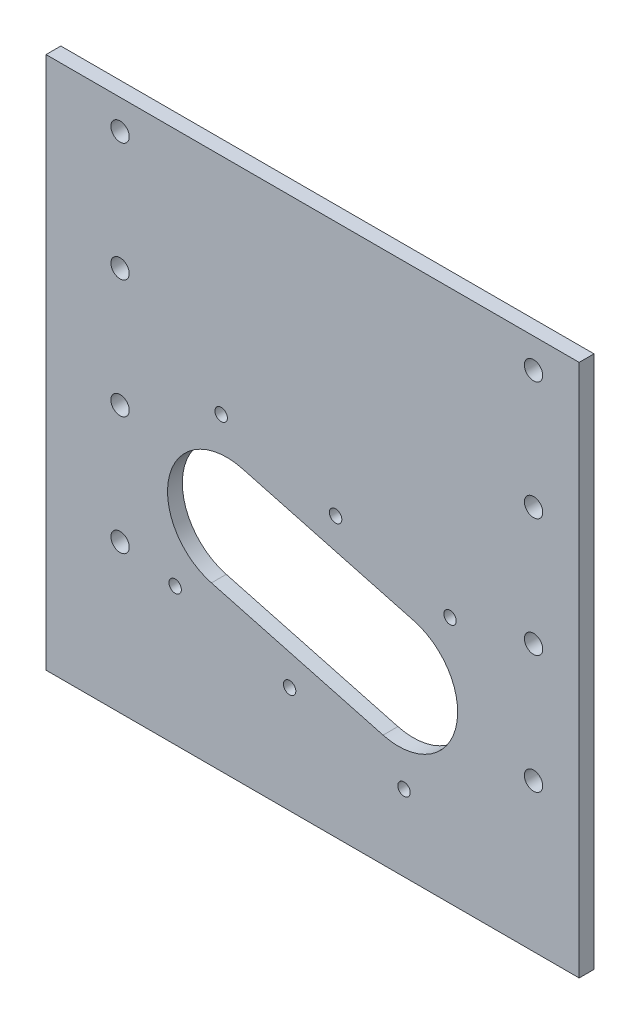
ISO-10303-21;
HEADER;
FILE_DESCRIPTION(('STEP AP214'),'2;1');
FILE_NAME('part.step','',(''),(''),'','','');
FILE_SCHEMA(('AUTOMOTIVE_DESIGN { 1 0 10303 214 1 1 1 1 }'));
ENDSEC;
DATA;
#1=APPLICATION_CONTEXT('core data for automotive mechanical design processes');
#2=APPLICATION_PROTOCOL_DEFINITION('international standard','automotive_design',2000,#1);
#3=PRODUCT_CONTEXT('',#1,'mechanical');
#4=PRODUCT('Part','Part','',(#3));
#5=PRODUCT_RELATED_PRODUCT_CATEGORY('part','',(#4));
#6=PRODUCT_DEFINITION_FORMATION('','',#4);
#7=PRODUCT_DEFINITION_CONTEXT('part definition',#1,'design');
#8=PRODUCT_DEFINITION('design','',#6,#7);
#9=PRODUCT_DEFINITION_SHAPE('','',#8);
#10=(LENGTH_UNIT() NAMED_UNIT(*) SI_UNIT(.MILLI.,.METRE.));
#11=(NAMED_UNIT(*) PLANE_ANGLE_UNIT() SI_UNIT($,.RADIAN.));
#12=(NAMED_UNIT(*) SI_UNIT($,.STERADIAN.) SOLID_ANGLE_UNIT());
#13=UNCERTAINTY_MEASURE_WITH_UNIT(LENGTH_MEASURE(1.E-05),#10,'distance_accuracy_value','');
#14=(GEOMETRIC_REPRESENTATION_CONTEXT(3) GLOBAL_UNCERTAINTY_ASSIGNED_CONTEXT((#13)) GLOBAL_UNIT_ASSIGNED_CONTEXT((#10,
#11,#12)) REPRESENTATION_CONTEXT('',''));
#15=CARTESIAN_POINT('',(0.,0.,0.));
#16=DIRECTION('',(0.,0.,1.));
#17=DIRECTION('',(1.,0.,0.));
#18=AXIS2_PLACEMENT_3D('',#15,#16,#17);
#19=CARTESIAN_POINT('',(90.,-90.,5.));
#20=DIRECTION('',(-1.,0.,0.));
#21=DIRECTION('',(0.,0.,1.));
#22=AXIS2_PLACEMENT_3D('',#19,#20,#21);
#23=PLANE('',#22);
#24=DIRECTION('',(0.,1.,0.));
#25=VECTOR('',#24,1.);
#26=CARTESIAN_POINT('',(90.,-90.,0.));
#27=LINE('',#26,#25);
#28=CARTESIAN_POINT('',(90.,-90.,0.));
#29=VERTEX_POINT('',#28);
#30=CARTESIAN_POINT('',(90.,90.,0.));
#31=VERTEX_POINT('',#30);
#32=EDGE_CURVE('E134',#29,#31,#27,.T.);
#33=ORIENTED_EDGE('',*,*,#32,.T.);
#34=DIRECTION('',(0.,0.,-1.));
#35=VECTOR('',#34,1.);
#36=CARTESIAN_POINT('',(90.,90.,5.));
#37=LINE('',#36,#35);
#38=CARTESIAN_POINT('',(90.,90.,5.));
#39=VERTEX_POINT('',#38);
#40=EDGE_CURVE('E11',#39,#31,#37,.T.);
#41=ORIENTED_EDGE('',*,*,#40,.F.);
#42=DIRECTION('',(0.,1.,0.));
#43=VECTOR('',#42,1.);
#44=CARTESIAN_POINT('',(90.,-90.,5.));
#45=LINE('',#44,#43);
#46=CARTESIAN_POINT('',(90.,-90.,5.));
#47=VERTEX_POINT('',#46);
#48=EDGE_CURVE('E138',#47,#39,#45,.T.);
#49=ORIENTED_EDGE('',*,*,#48,.F.);
#50=DIRECTION('',(0.,0.,-1.));
#51=VECTOR('',#50,1.);
#52=CARTESIAN_POINT('',(90.,-90.,5.));
#53=LINE('',#52,#51);
#54=EDGE_CURVE('E148',#47,#29,#53,.T.);
#55=ORIENTED_EDGE('',*,*,#54,.T.);
#56=EDGE_LOOP('',(#33,#41,#49,#55));
#57=FACE_BOUND('',#56,.T.);
#58=ADVANCED_FACE('F33',(#57),#23,.F.);
#59=CARTESIAN_POINT('',(-90.,90.,5.));
#60=DIRECTION('',(0.,-1.,0.));
#61=DIRECTION('',(0.,0.,-1.));
#62=AXIS2_PLACEMENT_3D('',#59,#60,#61);
#63=PLANE('',#62);
#64=DIRECTION('',(-1.,0.,0.));
#65=VECTOR('',#64,1.);
#66=CARTESIAN_POINT('',(-90.,90.,0.));
#67=LINE('',#66,#65);
#68=CARTESIAN_POINT('',(-90.,90.,0.));
#69=VERTEX_POINT('',#68);
#70=EDGE_CURVE('E151',#31,#69,#67,.T.);
#71=ORIENTED_EDGE('',*,*,#70,.T.);
#72=DIRECTION('',(0.,0.,-1.));
#73=VECTOR('',#72,1.);
#74=CARTESIAN_POINT('',(-90.,90.,5.));
#75=LINE('',#74,#73);
#76=CARTESIAN_POINT('',(-90.,90.,5.));
#77=VERTEX_POINT('',#76);
#78=EDGE_CURVE('E40',#77,#69,#75,.T.);
#79=ORIENTED_EDGE('',*,*,#78,.F.);
#80=DIRECTION('',(-1.,0.,0.));
#81=VECTOR('',#80,1.);
#82=CARTESIAN_POINT('',(-90.,90.,5.));
#83=LINE('',#82,#81);
#84=EDGE_CURVE('E141',#39,#77,#83,.T.);
#85=ORIENTED_EDGE('',*,*,#84,.F.);
#86=ORIENTED_EDGE('',*,*,#40,.T.);
#87=EDGE_LOOP('',(#71,#79,#85,#86));
#88=FACE_BOUND('',#87,.T.);
#89=ADVANCED_FACE('F179',(#88),#63,.F.);
#90=CARTESIAN_POINT('',(-90.,-90.,5.));
#91=DIRECTION('',(1.,0.,0.));
#92=DIRECTION('',(0.,0.,-1.));
#93=AXIS2_PLACEMENT_3D('',#90,#91,#92);
#94=PLANE('',#93);
#95=DIRECTION('',(0.,-1.,0.));
#96=VECTOR('',#95,1.);
#97=CARTESIAN_POINT('',(-90.,-90.,0.));
#98=LINE('',#97,#96);
#99=CARTESIAN_POINT('',(-90.,-90.,0.));
#100=VERTEX_POINT('',#99);
#101=EDGE_CURVE('E153',#69,#100,#98,.T.);
#102=ORIENTED_EDGE('',*,*,#101,.T.);
#103=DIRECTION('',(0.,0.,-1.));
#104=VECTOR('',#103,1.);
#105=CARTESIAN_POINT('',(-90.,-90.,5.));
#106=LINE('',#105,#104);
#107=CARTESIAN_POINT('',(-90.,-90.,5.));
#108=VERTEX_POINT('',#107);
#109=EDGE_CURVE('E158',#108,#100,#106,.T.);
#110=ORIENTED_EDGE('',*,*,#109,.F.);
#111=DIRECTION('',(0.,-1.,0.));
#112=VECTOR('',#111,1.);
#113=CARTESIAN_POINT('',(-90.,-90.,5.));
#114=LINE('',#113,#112);
#115=EDGE_CURVE('E144',#77,#108,#114,.T.);
#116=ORIENTED_EDGE('',*,*,#115,.F.);
#117=ORIENTED_EDGE('',*,*,#78,.T.);
#118=EDGE_LOOP('',(#102,#110,#116,#117));
#119=FACE_BOUND('',#118,.T.);
#120=ADVANCED_FACE('F165',(#119),#94,.F.);
#121=CARTESIAN_POINT('',(-90.,-90.,5.));
#122=DIRECTION('',(0.,1.,0.));
#123=DIRECTION('',(0.,0.,1.));
#124=AXIS2_PLACEMENT_3D('',#121,#122,#123);
#125=PLANE('',#124);
#126=DIRECTION('',(1.,0.,0.));
#127=VECTOR('',#126,1.);
#128=CARTESIAN_POINT('',(-90.,-90.,0.));
#129=LINE('',#128,#127);
#130=EDGE_CURVE('E142',#100,#29,#129,.T.);
#131=ORIENTED_EDGE('',*,*,#130,.T.);
#132=ORIENTED_EDGE('',*,*,#54,.F.);
#133=DIRECTION('',(1.,0.,0.));
#134=VECTOR('',#133,1.);
#135=CARTESIAN_POINT('',(-90.,-90.,5.));
#136=LINE('',#135,#134);
#137=EDGE_CURVE('E146',#108,#47,#136,.T.);
#138=ORIENTED_EDGE('',*,*,#137,.F.);
#139=ORIENTED_EDGE('',*,*,#109,.T.);
#140=EDGE_LOOP('',(#131,#132,#138,#139));
#141=FACE_BOUND('',#140,.T.);
#142=ADVANCED_FACE('F174',(#141),#125,.F.);
#143=CARTESIAN_POINT('',(0.,0.,5.));
#144=DIRECTION('',(0.,0.,-1.));
#145=DIRECTION('',(-1.,0.,0.));
#146=AXIS2_PLACEMENT_3D('',#143,#144,#145);
#147=PLANE('',#146);
#148=CARTESIAN_POINT('',(46.4016044046382,-6.37498701542849,5.));
#149=DIRECTION('',(0.,0.,-1.));
#150=DIRECTION('',(1.,0.,0.));
#151=AXIS2_PLACEMENT_3D('',#148,#149,#150);
#152=CIRCLE('',#151,2.1);
#153=CARTESIAN_POINT('',(48.5016044046383,-6.37498701542849,5.));
#154=VERTEX_POINT('',#153);
#155=EDGE_CURVE('E293',#154,#154,#152,.T.);
#156=ORIENTED_EDGE('',*,*,#155,.T.);
#157=EDGE_LOOP('',(#156));
#158=FACE_BOUND('',#157,.T.);
#159=CARTESIAN_POINT('',(-46.4016044046382,-43.6250129845715,5.));
#160=DIRECTION('',(0.,0.,-1.));
#161=DIRECTION('',(1.,0.,0.));
#162=AXIS2_PLACEMENT_3D('',#159,#160,#161);
#163=CIRCLE('',#162,2.10000000000002);
#164=CARTESIAN_POINT('',(-44.3016044046382,-43.6250129845715,5.));
#165=VERTEX_POINT('',#164);
#166=EDGE_CURVE('E287',#165,#165,#163,.T.);
#167=ORIENTED_EDGE('',*,*,#166,.T.);
#168=EDGE_LOOP('',(#167));
#169=FACE_BOUND('',#168,.T.);
#170=CARTESIAN_POINT('',(-30.8724616984873,14.3305365927727,5.));
#171=DIRECTION('',(0.,0.,-1.));
#172=DIRECTION('',(-1.,0.,0.));
#173=AXIS2_PLACEMENT_3D('',#170,#171,#172);
#174=CIRCLE('',#173,2.1);
#175=CARTESIAN_POINT('',(-32.9724616984873,14.3305365927727,5.));
#176=VERTEX_POINT('',#175);
#177=EDGE_CURVE('E281',#176,#176,#174,.T.);
#178=ORIENTED_EDGE('',*,*,#177,.T.);
#179=EDGE_LOOP('',(#178));
#180=FACE_BOUND('',#179,.T.);
#181=CARTESIAN_POINT('',(30.8724616984873,-64.3305365927728,5.));
#182=DIRECTION('',(0.,0.,-1.));
#183=DIRECTION('',(-1.,0.,0.));
#184=AXIS2_PLACEMENT_3D('',#181,#182,#183);
#185=CIRCLE('',#184,2.10000000000001);
#186=CARTESIAN_POINT('',(28.7724616984873,-64.3305365927728,5.));
#187=VERTEX_POINT('',#186);
#188=EDGE_CURVE('E271',#187,#187,#185,.T.);
#189=ORIENTED_EDGE('',*,*,#188,.T.);
#190=EDGE_LOOP('',(#189));
#191=FACE_BOUND('',#190,.T.);
#192=CARTESIAN_POINT('',(-7.76457135307544,-53.9777747886721,5.));
#193=DIRECTION('',(0.,0.,-1.));
#194=DIRECTION('',(1.,0.,0.));
#195=AXIS2_PLACEMENT_3D('',#192,#193,#194);
#196=CIRCLE('',#195,2.10000000000002);
#197=CARTESIAN_POINT('',(-5.66457135307543,-53.9777747886721,5.));
#198=VERTEX_POINT('',#197);
#199=EDGE_CURVE('E266',#198,#198,#196,.T.);
#200=ORIENTED_EDGE('',*,*,#199,.T.);
#201=EDGE_LOOP('',(#200));
#202=FACE_BOUND('',#201,.T.);
#203=CARTESIAN_POINT('',(7.76457135307546,3.97777478867212,5.));
#204=DIRECTION('',(0.,0.,-1.));
#205=DIRECTION('',(-1.,0.,0.));
#206=AXIS2_PLACEMENT_3D('',#203,#204,#205);
#207=CIRCLE('',#206,2.1);
#208=CARTESIAN_POINT('',(5.66457135307545,3.97777478867212,5.));
#209=VERTEX_POINT('',#208);
#210=EDGE_CURVE('E299',#209,#209,#207,.T.);
#211=ORIENTED_EDGE('',*,*,#210,.T.);
#212=EDGE_LOOP('',(#211));
#213=FACE_BOUND('',#212,.T.);
#214=CARTESIAN_POINT('',(74.6004090081324,80.0000000000011,5.));
#215=DIRECTION('',(0.,0.,-1.));
#216=DIRECTION('',(-1.,0.,0.));
#217=AXIS2_PLACEMENT_3D('',#214,#215,#216);
#218=CIRCLE('',#217,3.1);
#219=CARTESIAN_POINT('',(71.5004090081324,80.0000000000011,5.));
#220=VERTEX_POINT('',#219);
#221=EDGE_CURVE('E305',#220,#220,#218,.T.);
#222=ORIENTED_EDGE('',*,*,#221,.T.);
#223=EDGE_LOOP('',(#222));
#224=FACE_BOUND('',#223,.T.);
#225=CARTESIAN_POINT('',(74.6004090081324,40.0000000000011,5.));
#226=DIRECTION('',(0.,0.,-1.));
#227=DIRECTION('',(-1.,0.,0.));
#228=AXIS2_PLACEMENT_3D('',#225,#226,#227);
#229=CIRCLE('',#228,3.1);
#230=CARTESIAN_POINT('',(71.5004090081324,40.0000000000011,5.));
#231=VERTEX_POINT('',#230);
#232=EDGE_CURVE('E311',#231,#231,#229,.T.);
#233=ORIENTED_EDGE('',*,*,#232,.T.);
#234=EDGE_LOOP('',(#233));
#235=FACE_BOUND('',#234,.T.);
#236=CARTESIAN_POINT('',(74.6004090081324,1.09634523681734E-12,5.));
#237=DIRECTION('',(0.,0.,-1.));
#238=DIRECTION('',(-1.,0.,0.));
#239=AXIS2_PLACEMENT_3D('',#236,#237,#238);
#240=CIRCLE('',#239,3.1);
#241=CARTESIAN_POINT('',(71.5004090081324,1.09634523681734E-12,5.));
#242=VERTEX_POINT('',#241);
#243=EDGE_CURVE('E317',#242,#242,#240,.T.);
#244=ORIENTED_EDGE('',*,*,#243,.T.);
#245=EDGE_LOOP('',(#244));
#246=FACE_BOUND('',#245,.T.);
#247=CARTESIAN_POINT('',(74.6004090081324,-39.9999999999989,5.));
#248=DIRECTION('',(0.,0.,-1.));
#249=DIRECTION('',(-1.,0.,0.));
#250=AXIS2_PLACEMENT_3D('',#247,#248,#249);
#251=CIRCLE('',#250,3.1);
#252=CARTESIAN_POINT('',(71.5004090081324,-39.9999999999989,5.));
#253=VERTEX_POINT('',#252);
#254=EDGE_CURVE('E323',#253,#253,#251,.T.);
#255=ORIENTED_EDGE('',*,*,#254,.T.);
#256=EDGE_LOOP('',(#255));
#257=FACE_BOUND('',#256,.T.);
#258=CARTESIAN_POINT('',(-65.0000000000003,79.9999999999999,5.));
#259=DIRECTION('',(0.,0.,1.));
#260=DIRECTION('',(1.,0.,0.));
#261=AXIS2_PLACEMENT_3D('',#258,#259,#260);
#262=CIRCLE('',#261,3.1);
#263=CARTESIAN_POINT('',(-61.9000000000003,79.9999999999999,5.));
#264=VERTEX_POINT('',#263);
#265=EDGE_CURVE('E330',#264,#264,#262,.T.);
#266=ORIENTED_EDGE('',*,*,#265,.F.);
#267=EDGE_LOOP('',(#266));
#268=FACE_BOUND('',#267,.T.);
#269=CARTESIAN_POINT('',(-65.0000000000004,39.9999999999999,5.));
#270=DIRECTION('',(0.,0.,1.));
#271=DIRECTION('',(1.,0.,0.));
#272=AXIS2_PLACEMENT_3D('',#269,#270,#271);
#273=CIRCLE('',#272,3.1);
#274=CARTESIAN_POINT('',(-61.9000000000004,39.9999999999999,5.));
#275=VERTEX_POINT('',#274);
#276=EDGE_CURVE('E336',#275,#275,#273,.T.);
#277=ORIENTED_EDGE('',*,*,#276,.F.);
#278=EDGE_LOOP('',(#277));
#279=FACE_BOUND('',#278,.T.);
#280=CARTESIAN_POINT('',(-65.0000000000006,0.,5.));
#281=DIRECTION('',(0.,0.,1.));
#282=DIRECTION('',(1.,0.,0.));
#283=AXIS2_PLACEMENT_3D('',#280,#281,#282);
#284=CIRCLE('',#283,3.1);
#285=CARTESIAN_POINT('',(-61.9000000000006,0.,5.));
#286=VERTEX_POINT('',#285);
#287=EDGE_CURVE('E342',#286,#286,#284,.T.);
#288=ORIENTED_EDGE('',*,*,#287,.F.);
#289=EDGE_LOOP('',(#288));
#290=FACE_BOUND('',#289,.T.);
#291=CARTESIAN_POINT('',(-65.0000000000008,-40.0000000000001,5.));
#292=DIRECTION('',(0.,0.,1.));
#293=DIRECTION('',(1.,0.,0.));
#294=AXIS2_PLACEMENT_3D('',#291,#292,#293);
#295=CIRCLE('',#294,3.1);
#296=CARTESIAN_POINT('',(-61.9000000000008,-40.0000000000001,5.));
#297=VERTEX_POINT('',#296);
#298=EDGE_CURVE('E121',#297,#297,#295,.T.);
#299=ORIENTED_EDGE('',*,*,#298,.F.);
#300=EDGE_LOOP('',(#299));
#301=FACE_BOUND('',#300,.T.);
#302=DIRECTION('',(0.96592582628907,-0.258819045102515,0.));
#303=VECTOR('',#302,1.);
#304=CARTESIAN_POINT('',(34.1541556907224,-13.446054827294,5.));
#305=LINE('',#304,#303);
#306=CARTESIAN_POINT('',(-23.8013938866218,2.08308787885685,5.));
#307=VERTEX_POINT('',#306);
#308=CARTESIAN_POINT('',(34.1541556907224,-13.446054827294,5.));
#309=VERTEX_POINT('',#308);
#310=EDGE_CURVE('E105',#307,#309,#305,.T.);
#311=ORIENTED_EDGE('',*,*,#310,.T.);
#312=CARTESIAN_POINT('',(28.9777747886721,-32.7645713530754,5.));
#313=DIRECTION('',(0.,0.,-1.));
#314=DIRECTION('',(-1.,0.,0.));
#315=AXIS2_PLACEMENT_3D('',#312,#313,#314);
#316=CIRCLE('',#315,20.);
#317=CARTESIAN_POINT('',(23.8013938866218,-52.0830878788568,5.));
#318=VERTEX_POINT('',#317);
#319=EDGE_CURVE('E99',#309,#318,#316,.T.);
#320=ORIENTED_EDGE('',*,*,#319,.T.);
#321=DIRECTION('',(-0.96592582628907,0.258819045102515,0.));
#322=VECTOR('',#321,1.);
#323=CARTESIAN_POINT('',(23.8013938866218,-52.0830878788568,5.));
#324=LINE('',#323,#322);
#325=CARTESIAN_POINT('',(-34.1541556907224,-36.5539451727059,5.));
#326=VERTEX_POINT('',#325);
#327=EDGE_CURVE('E108',#318,#326,#324,.T.);
#328=ORIENTED_EDGE('',*,*,#327,.T.);
#329=CARTESIAN_POINT('',(-28.9777747886721,-17.2354286469246,5.));
#330=DIRECTION('',(0.,0.,-1.));
#331=DIRECTION('',(-1.,0.,0.));
#332=AXIS2_PLACEMENT_3D('',#329,#330,#331);
#333=CIRCLE('',#332,20.);
#334=EDGE_CURVE('E47',#326,#307,#333,.T.);
#335=ORIENTED_EDGE('',*,*,#334,.T.);
#336=EDGE_LOOP('',(#311,#320,#328,#335));
#337=FACE_BOUND('',#336,.T.);
#338=ORIENTED_EDGE('',*,*,#48,.T.);
#339=ORIENTED_EDGE('',*,*,#84,.T.);
#340=ORIENTED_EDGE('',*,*,#115,.T.);
#341=ORIENTED_EDGE('',*,*,#137,.T.);
#342=EDGE_LOOP('',(#338,#339,#340,#341));
#343=FACE_BOUND('',#342,.T.);
#344=ADVANCED_FACE('F112',(#158,#169,#180,#191,#202,#213,#224,#235,#246,#257,#268,#279,#290,
#301,#337,#343),#147,.F.);
#345=CARTESIAN_POINT('',(0.,0.,0.));
#346=DIRECTION('',(0.,0.,-1.));
#347=DIRECTION('',(-1.,0.,0.));
#348=AXIS2_PLACEMENT_3D('',#345,#346,#347);
#349=PLANE('',#348);
#350=CARTESIAN_POINT('',(46.4016044046382,-6.37498701542849,0.));
#351=DIRECTION('',(0.,0.,-1.));
#352=DIRECTION('',(1.,0.,0.));
#353=AXIS2_PLACEMENT_3D('',#350,#351,#352);
#354=CIRCLE('',#353,2.1);
#355=CARTESIAN_POINT('',(48.5016044046383,-6.37498701542849,0.));
#356=VERTEX_POINT('',#355);
#357=EDGE_CURVE('E296',#356,#356,#354,.T.);
#358=ORIENTED_EDGE('',*,*,#357,.F.);
#359=EDGE_LOOP('',(#358));
#360=FACE_BOUND('',#359,.T.);
#361=CARTESIAN_POINT('',(-46.4016044046382,-43.6250129845715,0.));
#362=DIRECTION('',(0.,0.,-1.));
#363=DIRECTION('',(1.,0.,0.));
#364=AXIS2_PLACEMENT_3D('',#361,#362,#363);
#365=CIRCLE('',#364,2.10000000000002);
#366=CARTESIAN_POINT('',(-44.3016044046382,-43.6250129845715,0.));
#367=VERTEX_POINT('',#366);
#368=EDGE_CURVE('E290',#367,#367,#365,.T.);
#369=ORIENTED_EDGE('',*,*,#368,.F.);
#370=EDGE_LOOP('',(#369));
#371=FACE_BOUND('',#370,.T.);
#372=CARTESIAN_POINT('',(-30.8724616984873,14.3305365927727,0.));
#373=DIRECTION('',(0.,0.,-1.));
#374=DIRECTION('',(-1.,0.,0.));
#375=AXIS2_PLACEMENT_3D('',#372,#373,#374);
#376=CIRCLE('',#375,2.1);
#377=CARTESIAN_POINT('',(-32.9724616984873,14.3305365927727,0.));
#378=VERTEX_POINT('',#377);
#379=EDGE_CURVE('E284',#378,#378,#376,.T.);
#380=ORIENTED_EDGE('',*,*,#379,.F.);
#381=EDGE_LOOP('',(#380));
#382=FACE_BOUND('',#381,.T.);
#383=CARTESIAN_POINT('',(30.8724616984873,-64.3305365927728,0.));
#384=DIRECTION('',(0.,0.,-1.));
#385=DIRECTION('',(-1.,0.,0.));
#386=AXIS2_PLACEMENT_3D('',#383,#384,#385);
#387=CIRCLE('',#386,2.10000000000001);
#388=CARTESIAN_POINT('',(28.7724616984873,-64.3305365927728,0.));
#389=VERTEX_POINT('',#388);
#390=EDGE_CURVE('E276',#389,#389,#387,.T.);
#391=ORIENTED_EDGE('',*,*,#390,.F.);
#392=EDGE_LOOP('',(#391));
#393=FACE_BOUND('',#392,.T.);
#394=CARTESIAN_POINT('',(-7.76457135307544,-53.9777747886721,0.));
#395=DIRECTION('',(0.,0.,-1.));
#396=DIRECTION('',(1.,0.,0.));
#397=AXIS2_PLACEMENT_3D('',#394,#395,#396);
#398=CIRCLE('',#397,2.10000000000002);
#399=CARTESIAN_POINT('',(-5.66457135307543,-53.9777747886721,0.));
#400=VERTEX_POINT('',#399);
#401=EDGE_CURVE('E269',#400,#400,#398,.T.);
#402=ORIENTED_EDGE('',*,*,#401,.F.);
#403=EDGE_LOOP('',(#402));
#404=FACE_BOUND('',#403,.T.);
#405=CARTESIAN_POINT('',(7.76457135307546,3.97777478867212,0.));
#406=DIRECTION('',(0.,0.,-1.));
#407=DIRECTION('',(-1.,0.,0.));
#408=AXIS2_PLACEMENT_3D('',#405,#406,#407);
#409=CIRCLE('',#408,2.1);
#410=CARTESIAN_POINT('',(5.66457135307545,3.97777478867212,0.));
#411=VERTEX_POINT('',#410);
#412=EDGE_CURVE('E273',#411,#411,#409,.T.);
#413=ORIENTED_EDGE('',*,*,#412,.F.);
#414=EDGE_LOOP('',(#413));
#415=FACE_BOUND('',#414,.T.);
#416=CARTESIAN_POINT('',(74.6004090081324,80.0000000000011,0.));
#417=DIRECTION('',(0.,0.,-1.));
#418=DIRECTION('',(-1.,0.,0.));
#419=AXIS2_PLACEMENT_3D('',#416,#417,#418);
#420=CIRCLE('',#419,3.1);
#421=CARTESIAN_POINT('',(71.5004090081324,80.0000000000011,0.));
#422=VERTEX_POINT('',#421);
#423=EDGE_CURVE('E308',#422,#422,#420,.T.);
#424=ORIENTED_EDGE('',*,*,#423,.F.);
#425=EDGE_LOOP('',(#424));
#426=FACE_BOUND('',#425,.T.);
#427=CARTESIAN_POINT('',(74.6004090081324,40.0000000000011,0.));
#428=DIRECTION('',(0.,0.,-1.));
#429=DIRECTION('',(-1.,0.,0.));
#430=AXIS2_PLACEMENT_3D('',#427,#428,#429);
#431=CIRCLE('',#430,3.1);
#432=CARTESIAN_POINT('',(71.5004090081324,40.0000000000011,0.));
#433=VERTEX_POINT('',#432);
#434=EDGE_CURVE('E314',#433,#433,#431,.T.);
#435=ORIENTED_EDGE('',*,*,#434,.F.);
#436=EDGE_LOOP('',(#435));
#437=FACE_BOUND('',#436,.T.);
#438=CARTESIAN_POINT('',(74.6004090081324,1.09634523681734E-12,0.));
#439=DIRECTION('',(0.,0.,-1.));
#440=DIRECTION('',(-1.,0.,0.));
#441=AXIS2_PLACEMENT_3D('',#438,#439,#440);
#442=CIRCLE('',#441,3.1);
#443=CARTESIAN_POINT('',(71.5004090081324,1.09634523681734E-12,0.));
#444=VERTEX_POINT('',#443);
#445=EDGE_CURVE('E320',#444,#444,#442,.T.);
#446=ORIENTED_EDGE('',*,*,#445,.F.);
#447=EDGE_LOOP('',(#446));
#448=FACE_BOUND('',#447,.T.);
#449=CARTESIAN_POINT('',(74.6004090081324,-39.9999999999989,0.));
#450=DIRECTION('',(0.,0.,-1.));
#451=DIRECTION('',(-1.,0.,0.));
#452=AXIS2_PLACEMENT_3D('',#449,#450,#451);
#453=CIRCLE('',#452,3.1);
#454=CARTESIAN_POINT('',(71.5004090081324,-39.9999999999989,0.));
#455=VERTEX_POINT('',#454);
#456=EDGE_CURVE('E302',#455,#455,#453,.T.);
#457=ORIENTED_EDGE('',*,*,#456,.F.);
#458=EDGE_LOOP('',(#457));
#459=FACE_BOUND('',#458,.T.);
#460=CARTESIAN_POINT('',(-65.0000000000003,79.9999999999999,0.));
#461=DIRECTION('',(0.,0.,1.));
#462=DIRECTION('',(1.,0.,0.));
#463=AXIS2_PLACEMENT_3D('',#460,#461,#462);
#464=CIRCLE('',#463,3.1);
#465=CARTESIAN_POINT('',(-61.9000000000003,79.9999999999999,0.));
#466=VERTEX_POINT('',#465);
#467=EDGE_CURVE('E128',#466,#466,#464,.T.);
#468=ORIENTED_EDGE('',*,*,#467,.T.);
#469=EDGE_LOOP('',(#468));
#470=FACE_BOUND('',#469,.T.);
#471=CARTESIAN_POINT('',(-65.0000000000004,39.9999999999999,0.));
#472=DIRECTION('',(0.,0.,1.));
#473=DIRECTION('',(1.,0.,0.));
#474=AXIS2_PLACEMENT_3D('',#471,#472,#473);
#475=CIRCLE('',#474,3.1);
#476=CARTESIAN_POINT('',(-61.9000000000004,39.9999999999999,0.));
#477=VERTEX_POINT('',#476);
#478=EDGE_CURVE('E333',#477,#477,#475,.T.);
#479=ORIENTED_EDGE('',*,*,#478,.T.);
#480=EDGE_LOOP('',(#479));
#481=FACE_BOUND('',#480,.T.);
#482=CARTESIAN_POINT('',(-65.0000000000006,0.,0.));
#483=DIRECTION('',(0.,0.,1.));
#484=DIRECTION('',(1.,0.,0.));
#485=AXIS2_PLACEMENT_3D('',#482,#483,#484);
#486=CIRCLE('',#485,3.1);
#487=CARTESIAN_POINT('',(-61.9000000000006,0.,0.));
#488=VERTEX_POINT('',#487);
#489=EDGE_CURVE('E339',#488,#488,#486,.T.);
#490=ORIENTED_EDGE('',*,*,#489,.T.);
#491=EDGE_LOOP('',(#490));
#492=FACE_BOUND('',#491,.T.);
#493=CARTESIAN_POINT('',(-65.0000000000008,-40.0000000000001,0.));
#494=DIRECTION('',(0.,0.,1.));
#495=DIRECTION('',(1.,0.,0.));
#496=AXIS2_PLACEMENT_3D('',#493,#494,#495);
#497=CIRCLE('',#496,3.1);
#498=CARTESIAN_POINT('',(-61.9000000000008,-40.0000000000001,0.));
#499=VERTEX_POINT('',#498);
#500=EDGE_CURVE('E344',#499,#499,#497,.T.);
#501=ORIENTED_EDGE('',*,*,#500,.T.);
#502=EDGE_LOOP('',(#501));
#503=FACE_BOUND('',#502,.T.);
#504=CARTESIAN_POINT('',(28.9777747886721,-32.7645713530754,0.));
#505=DIRECTION('',(0.,0.,-1.));
#506=DIRECTION('',(-1.,0.,0.));
#507=AXIS2_PLACEMENT_3D('',#504,#505,#506);
#508=CIRCLE('',#507,20.);
#509=CARTESIAN_POINT('',(34.1541556907224,-13.446054827294,0.));
#510=VERTEX_POINT('',#509);
#511=CARTESIAN_POINT('',(23.8013938866218,-52.0830878788568,0.));
#512=VERTEX_POINT('',#511);
#513=EDGE_CURVE('E55',#510,#512,#508,.T.);
#514=ORIENTED_EDGE('',*,*,#513,.F.);
#515=DIRECTION('',(0.96592582628907,-0.258819045102515,0.));
#516=VECTOR('',#515,1.);
#517=CARTESIAN_POINT('',(34.1541556907224,-13.446054827294,0.));
#518=LINE('',#517,#516);
#519=CARTESIAN_POINT('',(-23.8013938866218,2.08308787885685,0.));
#520=VERTEX_POINT('',#519);
#521=EDGE_CURVE('E115',#520,#510,#518,.T.);
#522=ORIENTED_EDGE('',*,*,#521,.F.);
#523=CARTESIAN_POINT('',(-28.9777747886721,-17.2354286469246,0.));
#524=DIRECTION('',(0.,0.,-1.));
#525=DIRECTION('',(-1.,0.,0.));
#526=AXIS2_PLACEMENT_3D('',#523,#524,#525);
#527=CIRCLE('',#526,20.);
#528=CARTESIAN_POINT('',(-34.1541556907224,-36.553945172706,0.));
#529=VERTEX_POINT('',#528);
#530=EDGE_CURVE('E118',#529,#520,#527,.T.);
#531=ORIENTED_EDGE('',*,*,#530,.F.);
#532=DIRECTION('',(-0.96592582628907,0.258819045102515,0.));
#533=VECTOR('',#532,1.);
#534=CARTESIAN_POINT('',(23.8013938866218,-52.0830878788568,0.));
#535=LINE('',#534,#533);
#536=EDGE_CURVE('E127',#512,#529,#535,.T.);
#537=ORIENTED_EDGE('',*,*,#536,.F.);
#538=EDGE_LOOP('',(#514,#522,#531,#537));
#539=FACE_BOUND('',#538,.T.);
#540=ORIENTED_EDGE('',*,*,#32,.F.);
#541=ORIENTED_EDGE('',*,*,#130,.F.);
#542=ORIENTED_EDGE('',*,*,#101,.F.);
#543=ORIENTED_EDGE('',*,*,#70,.F.);
#544=EDGE_LOOP('',(#540,#541,#542,#543));
#545=FACE_BOUND('',#544,.T.);
#546=ADVANCED_FACE('F171',(#360,#371,#382,#393,#404,#415,#426,#437,#448,#459,#470,#481,#492,
#503,#539,#545),#349,.T.);
#547=CARTESIAN_POINT('',(28.9777747886721,-32.7645713530754,5.));
#548=DIRECTION('',(0.,0.,-1.));
#549=DIRECTION('',(-1.,0.,0.));
#550=AXIS2_PLACEMENT_3D('',#547,#548,#549);
#551=CYLINDRICAL_SURFACE('',#550,20.);
#552=ORIENTED_EDGE('',*,*,#513,.T.);
#553=DIRECTION('',(0.,0.,-1.));
#554=VECTOR('',#553,1.);
#555=CARTESIAN_POINT('',(23.8013938866218,-52.0830878788568,5.));
#556=LINE('',#555,#554);
#557=EDGE_CURVE('E95',#318,#512,#556,.T.);
#558=ORIENTED_EDGE('',*,*,#557,.F.);
#559=ORIENTED_EDGE('',*,*,#319,.F.);
#560=DIRECTION('',(0.,0.,-1.));
#561=VECTOR('',#560,1.);
#562=CARTESIAN_POINT('',(34.1541556907224,-13.446054827294,5.));
#563=LINE('',#562,#561);
#564=EDGE_CURVE('E132',#309,#510,#563,.T.);
#565=ORIENTED_EDGE('',*,*,#564,.T.);
#566=EDGE_LOOP('',(#552,#558,#559,#565));
#567=FACE_BOUND('',#566,.T.);
#568=ADVANCED_FACE('F97',(#567),#551,.F.);
#569=CARTESIAN_POINT('',(34.1541556907224,-13.446054827294,5.));
#570=DIRECTION('',(0.258819045102515,0.96592582628907,0.));
#571=DIRECTION('',(-0.96592582628907,0.258819045102515,0.));
#572=AXIS2_PLACEMENT_3D('',#569,#570,#571);
#573=PLANE('',#572);
#574=ORIENTED_EDGE('',*,*,#521,.T.);
#575=ORIENTED_EDGE('',*,*,#564,.F.);
#576=ORIENTED_EDGE('',*,*,#310,.F.);
#577=DIRECTION('',(0.,0.,-1.));
#578=VECTOR('',#577,1.);
#579=CARTESIAN_POINT('',(-23.8013938866218,2.08308787885685,5.));
#580=LINE('',#579,#578);
#581=EDGE_CURVE('E135',#307,#520,#580,.T.);
#582=ORIENTED_EDGE('',*,*,#581,.T.);
#583=EDGE_LOOP('',(#574,#575,#576,#582));
#584=FACE_BOUND('',#583,.T.);
#585=ADVANCED_FACE('F197',(#584),#573,.F.);
#586=CARTESIAN_POINT('',(-28.9777747886721,-17.2354286469246,5.));
#587=DIRECTION('',(0.,0.,-1.));
#588=DIRECTION('',(-1.,0.,0.));
#589=AXIS2_PLACEMENT_3D('',#586,#587,#588);
#590=CYLINDRICAL_SURFACE('',#589,20.);
#591=ORIENTED_EDGE('',*,*,#530,.T.);
#592=ORIENTED_EDGE('',*,*,#581,.F.);
#593=ORIENTED_EDGE('',*,*,#334,.F.);
#594=DIRECTION('',(0.,0.,-1.));
#595=VECTOR('',#594,1.);
#596=CARTESIAN_POINT('',(-34.1541556907224,-36.553945172706,5.));
#597=LINE('',#596,#595);
#598=EDGE_CURVE('E104',#326,#529,#597,.T.);
#599=ORIENTED_EDGE('',*,*,#598,.T.);
#600=EDGE_LOOP('',(#591,#592,#593,#599));
#601=FACE_BOUND('',#600,.T.);
#602=ADVANCED_FACE('F201',(#601),#590,.F.);
#603=CARTESIAN_POINT('',(23.8013938866218,-52.0830878788568,5.));
#604=DIRECTION('',(-0.258819045102515,-0.96592582628907,0.));
#605=DIRECTION('',(0.96592582628907,-0.258819045102515,0.));
#606=AXIS2_PLACEMENT_3D('',#603,#604,#605);
#607=PLANE('',#606);
#608=ORIENTED_EDGE('',*,*,#536,.T.);
#609=ORIENTED_EDGE('',*,*,#598,.F.);
#610=ORIENTED_EDGE('',*,*,#327,.F.);
#611=ORIENTED_EDGE('',*,*,#557,.T.);
#612=EDGE_LOOP('',(#608,#609,#610,#611));
#613=FACE_BOUND('',#612,.T.);
#614=ADVANCED_FACE('F109',(#613),#607,.F.);
#615=CARTESIAN_POINT('',(-65.0000000000008,-40.0000000000001,0.));
#616=DIRECTION('',(0.,0.,1.));
#617=DIRECTION('',(1.,0.,0.));
#618=AXIS2_PLACEMENT_3D('',#615,#616,#617);
#619=CYLINDRICAL_SURFACE('',#618,3.1);
#620=ORIENTED_EDGE('',*,*,#500,.F.);
#621=EDGE_LOOP('',(#620));
#622=FACE_BOUND('',#621,.T.);
#623=ORIENTED_EDGE('',*,*,#298,.T.);
#624=EDGE_LOOP('',(#623));
#625=FACE_BOUND('',#624,.T.);
#626=ADVANCED_FACE('F200',(#622,#625),#619,.F.);
#627=CARTESIAN_POINT('',(-65.0000000000006,0.,0.));
#628=DIRECTION('',(0.,0.,1.));
#629=DIRECTION('',(1.,0.,0.));
#630=AXIS2_PLACEMENT_3D('',#627,#628,#629);
#631=CYLINDRICAL_SURFACE('',#630,3.1);
#632=ORIENTED_EDGE('',*,*,#489,.F.);
#633=EDGE_LOOP('',(#632));
#634=FACE_BOUND('',#633,.T.);
#635=ORIENTED_EDGE('',*,*,#287,.T.);
#636=EDGE_LOOP('',(#635));
#637=FACE_BOUND('',#636,.T.);
#638=ADVANCED_FACE('F209',(#634,#637),#631,.F.);
#639=CARTESIAN_POINT('',(-65.0000000000004,39.9999999999999,0.));
#640=DIRECTION('',(0.,0.,1.));
#641=DIRECTION('',(1.,0.,0.));
#642=AXIS2_PLACEMENT_3D('',#639,#640,#641);
#643=CYLINDRICAL_SURFACE('',#642,3.1);
#644=ORIENTED_EDGE('',*,*,#478,.F.);
#645=EDGE_LOOP('',(#644));
#646=FACE_BOUND('',#645,.T.);
#647=ORIENTED_EDGE('',*,*,#276,.T.);
#648=EDGE_LOOP('',(#647));
#649=FACE_BOUND('',#648,.T.);
#650=ADVANCED_FACE('F213',(#646,#649),#643,.F.);
#651=CARTESIAN_POINT('',(-65.0000000000003,79.9999999999999,0.));
#652=DIRECTION('',(0.,0.,1.));
#653=DIRECTION('',(1.,0.,0.));
#654=AXIS2_PLACEMENT_3D('',#651,#652,#653);
#655=CYLINDRICAL_SURFACE('',#654,3.1);
#656=ORIENTED_EDGE('',*,*,#467,.F.);
#657=EDGE_LOOP('',(#656));
#658=FACE_BOUND('',#657,.T.);
#659=ORIENTED_EDGE('',*,*,#265,.T.);
#660=EDGE_LOOP('',(#659));
#661=FACE_BOUND('',#660,.T.);
#662=ADVANCED_FACE('F217',(#658,#661),#655,.F.);
#663=CARTESIAN_POINT('',(74.6004090081324,-39.9999999999989,5.));
#664=DIRECTION('',(0.,0.,-1.));
#665=DIRECTION('',(-1.,0.,0.));
#666=AXIS2_PLACEMENT_3D('',#663,#664,#665);
#667=CYLINDRICAL_SURFACE('',#666,3.1);
#668=ORIENTED_EDGE('',*,*,#254,.F.);
#669=EDGE_LOOP('',(#668));
#670=FACE_BOUND('',#669,.T.);
#671=ORIENTED_EDGE('',*,*,#456,.T.);
#672=EDGE_LOOP('',(#671));
#673=FACE_BOUND('',#672,.T.);
#674=ADVANCED_FACE('F221',(#670,#673),#667,.F.);
#675=CARTESIAN_POINT('',(74.6004090081324,1.09634523681734E-12,5.));
#676=DIRECTION('',(0.,0.,-1.));
#677=DIRECTION('',(-1.,0.,0.));
#678=AXIS2_PLACEMENT_3D('',#675,#676,#677);
#679=CYLINDRICAL_SURFACE('',#678,3.1);
#680=ORIENTED_EDGE('',*,*,#243,.F.);
#681=EDGE_LOOP('',(#680));
#682=FACE_BOUND('',#681,.T.);
#683=ORIENTED_EDGE('',*,*,#445,.T.);
#684=EDGE_LOOP('',(#683));
#685=FACE_BOUND('',#684,.T.);
#686=ADVANCED_FACE('F225',(#682,#685),#679,.F.);
#687=CARTESIAN_POINT('',(74.6004090081324,40.0000000000011,5.));
#688=DIRECTION('',(0.,0.,-1.));
#689=DIRECTION('',(-1.,0.,0.));
#690=AXIS2_PLACEMENT_3D('',#687,#688,#689);
#691=CYLINDRICAL_SURFACE('',#690,3.1);
#692=ORIENTED_EDGE('',*,*,#232,.F.);
#693=EDGE_LOOP('',(#692));
#694=FACE_BOUND('',#693,.T.);
#695=ORIENTED_EDGE('',*,*,#434,.T.);
#696=EDGE_LOOP('',(#695));
#697=FACE_BOUND('',#696,.T.);
#698=ADVANCED_FACE('F229',(#694,#697),#691,.F.);
#699=CARTESIAN_POINT('',(74.6004090081324,80.0000000000011,5.));
#700=DIRECTION('',(0.,0.,-1.));
#701=DIRECTION('',(-1.,0.,0.));
#702=AXIS2_PLACEMENT_3D('',#699,#700,#701);
#703=CYLINDRICAL_SURFACE('',#702,3.1);
#704=ORIENTED_EDGE('',*,*,#221,.F.);
#705=EDGE_LOOP('',(#704));
#706=FACE_BOUND('',#705,.T.);
#707=ORIENTED_EDGE('',*,*,#423,.T.);
#708=EDGE_LOOP('',(#707));
#709=FACE_BOUND('',#708,.T.);
#710=ADVANCED_FACE('F233',(#706,#709),#703,.F.);
#711=CARTESIAN_POINT('',(7.76457135307546,3.97777478867212,5.));
#712=DIRECTION('',(0.,0.,-1.));
#713=DIRECTION('',(-1.,0.,0.));
#714=AXIS2_PLACEMENT_3D('',#711,#712,#713);
#715=CYLINDRICAL_SURFACE('',#714,2.1);
#716=ORIENTED_EDGE('',*,*,#210,.F.);
#717=EDGE_LOOP('',(#716));
#718=FACE_BOUND('',#717,.T.);
#719=ORIENTED_EDGE('',*,*,#412,.T.);
#720=EDGE_LOOP('',(#719));
#721=FACE_BOUND('',#720,.T.);
#722=ADVANCED_FACE('F237',(#718,#721),#715,.F.);
#723=CARTESIAN_POINT('',(-7.76457135307544,-53.9777747886721,5.));
#724=DIRECTION('',(0.,0.,-1.));
#725=DIRECTION('',(-1.,0.,0.));
#726=AXIS2_PLACEMENT_3D('',#723,#724,#725);
#727=CYLINDRICAL_SURFACE('',#726,2.10000000000002);
#728=ORIENTED_EDGE('',*,*,#199,.F.);
#729=EDGE_LOOP('',(#728));
#730=FACE_BOUND('',#729,.T.);
#731=ORIENTED_EDGE('',*,*,#401,.T.);
#732=EDGE_LOOP('',(#731));
#733=FACE_BOUND('',#732,.T.);
#734=ADVANCED_FACE('F241',(#730,#733),#727,.F.);
#735=CARTESIAN_POINT('',(30.8724616984873,-64.3305365927728,5.));
#736=DIRECTION('',(0.,0.,-1.));
#737=DIRECTION('',(-1.,0.,0.));
#738=AXIS2_PLACEMENT_3D('',#735,#736,#737);
#739=CYLINDRICAL_SURFACE('',#738,2.10000000000001);
#740=ORIENTED_EDGE('',*,*,#188,.F.);
#741=EDGE_LOOP('',(#740));
#742=FACE_BOUND('',#741,.T.);
#743=ORIENTED_EDGE('',*,*,#390,.T.);
#744=EDGE_LOOP('',(#743));
#745=FACE_BOUND('',#744,.T.);
#746=ADVANCED_FACE('F254',(#742,#745),#739,.F.);
#747=CARTESIAN_POINT('',(-30.8724616984873,14.3305365927727,5.));
#748=DIRECTION('',(0.,0.,-1.));
#749=DIRECTION('',(-1.,0.,0.));
#750=AXIS2_PLACEMENT_3D('',#747,#748,#749);
#751=CYLINDRICAL_SURFACE('',#750,2.1);
#752=ORIENTED_EDGE('',*,*,#177,.F.);
#753=EDGE_LOOP('',(#752));
#754=FACE_BOUND('',#753,.T.);
#755=ORIENTED_EDGE('',*,*,#379,.T.);
#756=EDGE_LOOP('',(#755));
#757=FACE_BOUND('',#756,.T.);
#758=ADVANCED_FACE('F250',(#754,#757),#751,.F.);
#759=CARTESIAN_POINT('',(-46.4016044046382,-43.6250129845715,5.));
#760=DIRECTION('',(0.,0.,-1.));
#761=DIRECTION('',(-1.,0.,0.));
#762=AXIS2_PLACEMENT_3D('',#759,#760,#761);
#763=CYLINDRICAL_SURFACE('',#762,2.10000000000002);
#764=ORIENTED_EDGE('',*,*,#166,.F.);
#765=EDGE_LOOP('',(#764));
#766=FACE_BOUND('',#765,.T.);
#767=ORIENTED_EDGE('',*,*,#368,.T.);
#768=EDGE_LOOP('',(#767));
#769=FACE_BOUND('',#768,.T.);
#770=ADVANCED_FACE('F246',(#766,#769),#763,.F.);
#771=CARTESIAN_POINT('',(46.4016044046382,-6.37498701542849,5.));
#772=DIRECTION('',(0.,0.,-1.));
#773=DIRECTION('',(-1.,0.,0.));
#774=AXIS2_PLACEMENT_3D('',#771,#772,#773);
#775=CYLINDRICAL_SURFACE('',#774,2.1);
#776=ORIENTED_EDGE('',*,*,#155,.F.);
#777=EDGE_LOOP('',(#776));
#778=FACE_BOUND('',#777,.T.);
#779=ORIENTED_EDGE('',*,*,#357,.T.);
#780=EDGE_LOOP('',(#779));
#781=FACE_BOUND('',#780,.T.);
#782=ADVANCED_FACE('F243',(#778,#781),#775,.F.);
#783=CLOSED_SHELL('',(#58,#89,#120,#142,#344,#546,#568,#585,#602,#614,#626,#638,#650,#662,#674,
#686,#698,#710,#722,#734,#746,#758,#770,#782));
#784=MANIFOLD_SOLID_BREP('B2',#783);
#785=ADVANCED_BREP_SHAPE_REPRESENTATION('',(#18,#784),#14);
#786=SHAPE_DEFINITION_REPRESENTATION(#9,#785);
ENDSEC;
END-ISO-10303-21;
